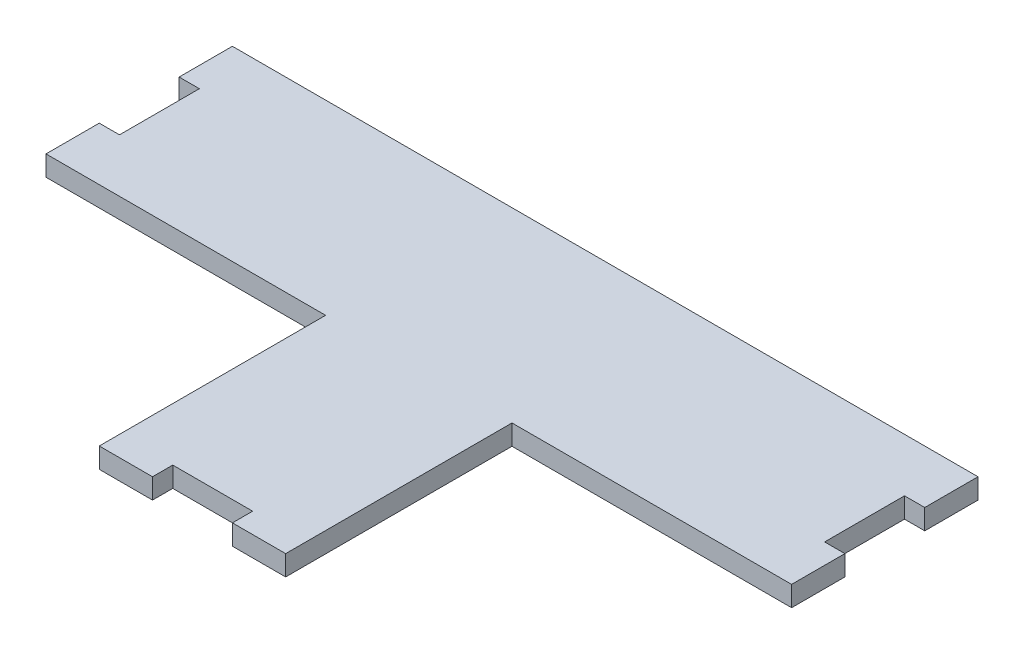
ISO-10303-21;
HEADER;
FILE_DESCRIPTION(('STEP AP214'),'2;1');
FILE_NAME('part.step','',(''),(''),'','','');
FILE_SCHEMA(('AUTOMOTIVE_DESIGN { 1 0 10303 214 1 1 1 1 }'));
ENDSEC;
DATA;
#1=APPLICATION_CONTEXT('core data for automotive mechanical design processes');
#2=APPLICATION_PROTOCOL_DEFINITION('international standard','automotive_design',2000,#1);
#3=PRODUCT_CONTEXT('',#1,'mechanical');
#4=PRODUCT('Part','Part','',(#3));
#5=PRODUCT_RELATED_PRODUCT_CATEGORY('part','',(#4));
#6=PRODUCT_DEFINITION_FORMATION('','',#4);
#7=PRODUCT_DEFINITION_CONTEXT('part definition',#1,'design');
#8=PRODUCT_DEFINITION('design','',#6,#7);
#9=PRODUCT_DEFINITION_SHAPE('','',#8);
#10=(LENGTH_UNIT() NAMED_UNIT(*) SI_UNIT(.MILLI.,.METRE.));
#11=(NAMED_UNIT(*) PLANE_ANGLE_UNIT() SI_UNIT($,.RADIAN.));
#12=(NAMED_UNIT(*) SI_UNIT($,.STERADIAN.) SOLID_ANGLE_UNIT());
#13=UNCERTAINTY_MEASURE_WITH_UNIT(LENGTH_MEASURE(1.E-05),#10,'distance_accuracy_value','');
#14=(GEOMETRIC_REPRESENTATION_CONTEXT(3) GLOBAL_UNCERTAINTY_ASSIGNED_CONTEXT((#13)) GLOBAL_UNIT_ASSIGNED_CONTEXT((#10,
#11,#12)) REPRESENTATION_CONTEXT('',''));
#15=CARTESIAN_POINT('',(0.,0.,0.));
#16=DIRECTION('',(0.,0.,1.));
#17=DIRECTION('',(1.,0.,0.));
#18=AXIS2_PLACEMENT_3D('',#15,#16,#17);
#19=CARTESIAN_POINT('',(0.,4.826,0.));
#20=DIRECTION('',(0.,0.,-1.));
#21=DIRECTION('',(-1.,0.,0.));
#22=AXIS2_PLACEMENT_3D('',#19,#20,#21);
#23=PLANE('',#22);
#24=DIRECTION('',(1.,0.,0.));
#25=VECTOR('',#24,1.);
#26=CARTESIAN_POINT('',(0.,4.826,0.));
#27=LINE('',#26,#25);
#28=CARTESIAN_POINT('',(66.675,4.826,0.));
#29=VERTEX_POINT('',#28);
#30=CARTESIAN_POINT('',(79.375,4.826,0.));
#31=VERTEX_POINT('',#30);
#32=EDGE_CURVE('E239',#29,#31,#27,.T.);
#33=ORIENTED_EDGE('',*,*,#32,.F.);
#34=DIRECTION('',(0.,1.,0.));
#35=VECTOR('',#34,1.);
#36=CARTESIAN_POINT('',(66.675,0.,0.));
#37=LINE('',#36,#35);
#38=CARTESIAN_POINT('',(66.675,0.,0.));
#39=VERTEX_POINT('',#38);
#40=EDGE_CURVE('E271',#39,#29,#37,.T.);
#41=ORIENTED_EDGE('',*,*,#40,.F.);
#42=DIRECTION('',(1.,0.,0.));
#43=VECTOR('',#42,1.);
#44=CARTESIAN_POINT('',(0.,0.,0.));
#45=LINE('',#44,#43);
#46=CARTESIAN_POINT('',(79.375,0.,0.));
#47=VERTEX_POINT('',#46);
#48=EDGE_CURVE('E197',#39,#47,#45,.T.);
#49=ORIENTED_EDGE('',*,*,#48,.T.);
#50=DIRECTION('',(0.,1.,0.));
#51=VECTOR('',#50,1.);
#52=CARTESIAN_POINT('',(79.375,0.,0.));
#53=LINE('',#52,#51);
#54=EDGE_CURVE('E290',#47,#31,#53,.T.);
#55=ORIENTED_EDGE('',*,*,#54,.T.);
#56=EDGE_LOOP('',(#33,#41,#49,#55));
#57=FACE_BOUND('',#56,.T.);
#58=ADVANCED_FACE('F32',(#57),#23,.F.);
#59=CARTESIAN_POINT('',(177.8,4.826,0.));
#60=DIRECTION('',(-1.,0.,0.));
#61=DIRECTION('',(0.,0.,1.));
#62=AXIS2_PLACEMENT_3D('',#59,#60,#61);
#63=PLANE('',#62);
#64=DIRECTION('',(0.,0.,-1.));
#65=VECTOR('',#64,1.);
#66=CARTESIAN_POINT('',(177.8,4.826,0.));
#67=LINE('',#66,#65);
#68=CARTESIAN_POINT('',(177.8,4.826,-53.975));
#69=VERTEX_POINT('',#68);
#70=CARTESIAN_POINT('',(177.8,4.826,-66.675));
#71=VERTEX_POINT('',#70);
#72=EDGE_CURVE('E185',#69,#71,#67,.T.);
#73=ORIENTED_EDGE('',*,*,#72,.F.);
#74=DIRECTION('',(0.,1.,0.));
#75=VECTOR('',#74,1.);
#76=CARTESIAN_POINT('',(177.8,0.,-53.975));
#77=LINE('',#76,#75);
#78=CARTESIAN_POINT('',(177.8,0.,-53.975));
#79=VERTEX_POINT('',#78);
#80=EDGE_CURVE('E172',#79,#69,#77,.T.);
#81=ORIENTED_EDGE('',*,*,#80,.F.);
#82=DIRECTION('',(0.,0.,-1.));
#83=VECTOR('',#82,1.);
#84=CARTESIAN_POINT('',(177.8,0.,0.));
#85=LINE('',#84,#83);
#86=CARTESIAN_POINT('',(177.8,0.,-66.675));
#87=VERTEX_POINT('',#86);
#88=EDGE_CURVE('E183',#79,#87,#85,.T.);
#89=ORIENTED_EDGE('',*,*,#88,.T.);
#90=DIRECTION('',(0.,1.,0.));
#91=VECTOR('',#90,1.);
#92=CARTESIAN_POINT('',(177.8,0.,-66.675));
#93=LINE('',#92,#91);
#94=EDGE_CURVE('E318',#87,#71,#93,.T.);
#95=ORIENTED_EDGE('',*,*,#94,.T.);
#96=EDGE_LOOP('',(#73,#81,#89,#95));
#97=FACE_BOUND('',#96,.T.);
#98=ADVANCED_FACE('F181',(#97),#63,.F.);
#99=CARTESIAN_POINT('',(0.,4.826,0.));
#100=DIRECTION('',(1.,0.,0.));
#101=DIRECTION('',(0.,0.,-1.));
#102=AXIS2_PLACEMENT_3D('',#99,#100,#101);
#103=PLANE('',#102);
#104=DIRECTION('',(0.,0.,1.));
#105=VECTOR('',#104,1.);
#106=CARTESIAN_POINT('',(0.,0.,0.));
#107=LINE('',#106,#105);
#108=CARTESIAN_POINT('',(0.,0.,-98.425));
#109=VERTEX_POINT('',#108);
#110=CARTESIAN_POINT('',(0.,0.,-85.725));
#111=VERTEX_POINT('',#110);
#112=EDGE_CURVE('E214',#109,#111,#107,.T.);
#113=ORIENTED_EDGE('',*,*,#112,.T.);
#114=DIRECTION('',(0.,1.,0.));
#115=VECTOR('',#114,1.);
#116=CARTESIAN_POINT('',(0.,0.,-85.725));
#117=LINE('',#116,#115);
#118=CARTESIAN_POINT('',(0.,4.826,-85.725));
#119=VERTEX_POINT('',#118);
#120=EDGE_CURVE('E220',#111,#119,#117,.T.);
#121=ORIENTED_EDGE('',*,*,#120,.T.);
#122=DIRECTION('',(0.,0.,1.));
#123=VECTOR('',#122,1.);
#124=CARTESIAN_POINT('',(0.,4.826,0.));
#125=LINE('',#124,#123);
#126=CARTESIAN_POINT('',(0.,4.826,-98.425));
#127=VERTEX_POINT('',#126);
#128=EDGE_CURVE('E237',#127,#119,#125,.T.);
#129=ORIENTED_EDGE('',*,*,#128,.F.);
#130=DIRECTION('',(0.,-1.,0.));
#131=VECTOR('',#130,1.);
#132=CARTESIAN_POINT('',(0.,4.826,-98.425));
#133=LINE('',#132,#131);
#134=EDGE_CURVE('E40',#127,#109,#133,.T.);
#135=ORIENTED_EDGE('',*,*,#134,.T.);
#136=EDGE_LOOP('',(#113,#121,#129,#135));
#137=FACE_BOUND('',#136,.T.);
#138=ADVANCED_FACE('F344',(#137),#103,.F.);
#139=CARTESIAN_POINT('',(0.,0.,-66.675));
#140=VERTEX_POINT('',#139);
#141=CARTESIAN_POINT('',(0.,0.,-53.975));
#142=VERTEX_POINT('',#141);
#143=EDGE_CURVE('E216',#140,#142,#107,.T.);
#144=ORIENTED_EDGE('',*,*,#143,.T.);
#145=DIRECTION('',(0.,1.,0.));
#146=VECTOR('',#145,1.);
#147=CARTESIAN_POINT('',(0.,0.,-53.975));
#148=LINE('',#147,#146);
#149=CARTESIAN_POINT('',(0.,4.826,-53.975));
#150=VERTEX_POINT('',#149);
#151=EDGE_CURVE('E274',#142,#150,#148,.T.);
#152=ORIENTED_EDGE('',*,*,#151,.T.);
#153=CARTESIAN_POINT('',(0.,4.826,-66.675));
#154=VERTEX_POINT('',#153);
#155=EDGE_CURVE('E195',#154,#150,#125,.T.);
#156=ORIENTED_EDGE('',*,*,#155,.F.);
#157=DIRECTION('',(0.,1.,0.));
#158=VECTOR('',#157,1.);
#159=CARTESIAN_POINT('',(0.,0.,-66.675));
#160=LINE('',#159,#158);
#161=EDGE_CURVE('E234',#140,#154,#160,.T.);
#162=ORIENTED_EDGE('',*,*,#161,.F.);
#163=EDGE_LOOP('',(#144,#152,#156,#162));
#164=FACE_BOUND('',#163,.T.);
#165=ADVANCED_FACE('F34',(#164),#103,.F.);
#166=CARTESIAN_POINT('',(98.425,0.,0.));
#167=VERTEX_POINT('',#166);
#168=CARTESIAN_POINT('',(111.125,0.,0.));
#169=VERTEX_POINT('',#168);
#170=EDGE_CURVE('E215',#167,#169,#45,.T.);
#171=ORIENTED_EDGE('',*,*,#170,.T.);
#172=DIRECTION('',(0.,1.,0.));
#173=VECTOR('',#172,1.);
#174=CARTESIAN_POINT('',(111.125,0.,0.));
#175=LINE('',#174,#173);
#176=CARTESIAN_POINT('',(111.125,4.826,0.));
#177=VERTEX_POINT('',#176);
#178=EDGE_CURVE('E258',#169,#177,#175,.T.);
#179=ORIENTED_EDGE('',*,*,#178,.T.);
#180=CARTESIAN_POINT('',(98.425,4.826,0.));
#181=VERTEX_POINT('',#180);
#182=EDGE_CURVE('E238',#181,#177,#27,.T.);
#183=ORIENTED_EDGE('',*,*,#182,.F.);
#184=DIRECTION('',(0.,1.,0.));
#185=VECTOR('',#184,1.);
#186=CARTESIAN_POINT('',(98.425,0.,0.));
#187=LINE('',#186,#185);
#188=EDGE_CURVE('E256',#167,#181,#187,.T.);
#189=ORIENTED_EDGE('',*,*,#188,.F.);
#190=EDGE_LOOP('',(#171,#179,#183,#189));
#191=FACE_BOUND('',#190,.T.);
#192=ADVANCED_FACE('F255',(#191),#23,.F.);
#193=CARTESIAN_POINT('',(177.8,4.826,-85.725));
#194=VERTEX_POINT('',#193);
#195=CARTESIAN_POINT('',(177.8,4.826,-98.425));
#196=VERTEX_POINT('',#195);
#197=EDGE_CURVE('E211',#194,#196,#67,.T.);
#198=ORIENTED_EDGE('',*,*,#197,.F.);
#199=DIRECTION('',(0.,1.,0.));
#200=VECTOR('',#199,1.);
#201=CARTESIAN_POINT('',(177.8,0.,-85.725));
#202=LINE('',#201,#200);
#203=CARTESIAN_POINT('',(177.8,0.,-85.725));
#204=VERTEX_POINT('',#203);
#205=EDGE_CURVE('E310',#204,#194,#202,.T.);
#206=ORIENTED_EDGE('',*,*,#205,.F.);
#207=CARTESIAN_POINT('',(177.8,0.,-98.425));
#208=VERTEX_POINT('',#207);
#209=EDGE_CURVE('E193',#204,#208,#85,.T.);
#210=ORIENTED_EDGE('',*,*,#209,.T.);
#211=DIRECTION('',(0.,-1.,0.));
#212=VECTOR('',#211,1.);
#213=CARTESIAN_POINT('',(177.8,4.826,-98.425));
#214=LINE('',#213,#212);
#215=EDGE_CURVE('E11',#196,#208,#214,.T.);
#216=ORIENTED_EDGE('',*,*,#215,.F.);
#217=EDGE_LOOP('',(#198,#206,#210,#216));
#218=FACE_BOUND('',#217,.T.);
#219=ADVANCED_FACE('F351',(#218),#63,.F.);
#220=CARTESIAN_POINT('',(0.,4.826,-98.425));
#221=DIRECTION('',(0.,0.,1.));
#222=DIRECTION('',(1.,0.,0.));
#223=AXIS2_PLACEMENT_3D('',#220,#221,#222);
#224=PLANE('',#223);
#225=DIRECTION('',(-1.,0.,0.));
#226=VECTOR('',#225,1.);
#227=CARTESIAN_POINT('',(0.,0.,-98.425));
#228=LINE('',#227,#226);
#229=EDGE_CURVE('E192',#208,#109,#228,.T.);
#230=ORIENTED_EDGE('',*,*,#229,.T.);
#231=ORIENTED_EDGE('',*,*,#134,.F.);
#232=DIRECTION('',(-1.,0.,0.));
#233=VECTOR('',#232,1.);
#234=CARTESIAN_POINT('',(0.,4.826,-98.425));
#235=LINE('',#234,#233);
#236=EDGE_CURVE('E201',#196,#127,#235,.T.);
#237=ORIENTED_EDGE('',*,*,#236,.F.);
#238=ORIENTED_EDGE('',*,*,#215,.T.);
#239=EDGE_LOOP('',(#230,#231,#237,#238));
#240=FACE_BOUND('',#239,.T.);
#241=ADVANCED_FACE('F360',(#240),#224,.F.);
#242=CARTESIAN_POINT('',(0.,4.826,0.));
#243=DIRECTION('',(0.,-1.,0.));
#244=DIRECTION('',(0.,0.,-1.));
#245=AXIS2_PLACEMENT_3D('',#242,#243,#244);
#246=PLANE('',#245);
#247=ORIENTED_EDGE('',*,*,#182,.T.);
#248=DIRECTION('',(0.,0.,1.));
#249=VECTOR('',#248,1.);
#250=CARTESIAN_POINT('',(111.125,4.826,0.));
#251=LINE('',#250,#249);
#252=CARTESIAN_POINT('',(111.125,4.826,-53.975));
#253=VERTEX_POINT('',#252);
#254=EDGE_CURVE('E177',#253,#177,#251,.T.);
#255=ORIENTED_EDGE('',*,*,#254,.F.);
#256=DIRECTION('',(-1.,0.,0.));
#257=VECTOR('',#256,1.);
#258=CARTESIAN_POINT('',(177.8,4.826,-53.975));
#259=LINE('',#258,#257);
#260=EDGE_CURVE('E419',#69,#253,#259,.T.);
#261=ORIENTED_EDGE('',*,*,#260,.F.);
#262=ORIENTED_EDGE('',*,*,#72,.T.);
#263=DIRECTION('',(1.,0.,0.));
#264=VECTOR('',#263,1.);
#265=CARTESIAN_POINT('',(177.8,4.826,-66.675));
#266=LINE('',#265,#264);
#267=CARTESIAN_POINT('',(172.974,4.826,-66.675));
#268=VERTEX_POINT('',#267);
#269=EDGE_CURVE('E307',#268,#71,#266,.T.);
#270=ORIENTED_EDGE('',*,*,#269,.F.);
#271=DIRECTION('',(0.,0.,1.));
#272=VECTOR('',#271,1.);
#273=CARTESIAN_POINT('',(172.974,4.826,-85.725));
#274=LINE('',#273,#272);
#275=CARTESIAN_POINT('',(172.974,4.826,-85.725));
#276=VERTEX_POINT('',#275);
#277=EDGE_CURVE('E313',#276,#268,#274,.T.);
#278=ORIENTED_EDGE('',*,*,#277,.F.);
#279=DIRECTION('',(-1.,0.,0.));
#280=VECTOR('',#279,1.);
#281=CARTESIAN_POINT('',(177.8,4.826,-85.725));
#282=LINE('',#281,#280);
#283=EDGE_CURVE('E297',#194,#276,#282,.T.);
#284=ORIENTED_EDGE('',*,*,#283,.F.);
#285=ORIENTED_EDGE('',*,*,#197,.T.);
#286=ORIENTED_EDGE('',*,*,#236,.T.);
#287=ORIENTED_EDGE('',*,*,#128,.T.);
#288=DIRECTION('',(-1.,0.,0.));
#289=VECTOR('',#288,1.);
#290=CARTESIAN_POINT('',(0.,4.826,-85.725));
#291=LINE('',#290,#289);
#292=CARTESIAN_POINT('',(4.82599999999997,4.826,-85.725));
#293=VERTEX_POINT('',#292);
#294=EDGE_CURVE('E230',#293,#119,#291,.T.);
#295=ORIENTED_EDGE('',*,*,#294,.F.);
#296=DIRECTION('',(0.,0.,-1.));
#297=VECTOR('',#296,1.);
#298=CARTESIAN_POINT('',(4.82599999999997,4.826,-85.725));
#299=LINE('',#298,#297);
#300=CARTESIAN_POINT('',(4.82599999999997,4.826,-66.675));
#301=VERTEX_POINT('',#300);
#302=EDGE_CURVE('E335',#301,#293,#299,.T.);
#303=ORIENTED_EDGE('',*,*,#302,.F.);
#304=DIRECTION('',(1.,0.,0.));
#305=VECTOR('',#304,1.);
#306=CARTESIAN_POINT('',(0.,4.826,-66.675));
#307=LINE('',#306,#305);
#308=EDGE_CURVE('E320',#154,#301,#307,.T.);
#309=ORIENTED_EDGE('',*,*,#308,.F.);
#310=ORIENTED_EDGE('',*,*,#155,.T.);
#311=DIRECTION('',(-1.,0.,0.));
#312=VECTOR('',#311,1.);
#313=CARTESIAN_POINT('',(0.,4.826,-53.975));
#314=LINE('',#313,#312);
#315=CARTESIAN_POINT('',(66.675,4.826,-53.975));
#316=VERTEX_POINT('',#315);
#317=EDGE_CURVE('E262',#316,#150,#314,.T.);
#318=ORIENTED_EDGE('',*,*,#317,.F.);
#319=DIRECTION('',(0.,0.,-1.));
#320=VECTOR('',#319,1.);
#321=CARTESIAN_POINT('',(66.675,4.826,0.));
#322=LINE('',#321,#320);
#323=EDGE_CURVE('E259',#29,#316,#322,.T.);
#324=ORIENTED_EDGE('',*,*,#323,.F.);
#325=ORIENTED_EDGE('',*,*,#32,.T.);
#326=DIRECTION('',(0.,0.,1.));
#327=VECTOR('',#326,1.);
#328=CARTESIAN_POINT('',(79.375,4.826,0.));
#329=LINE('',#328,#327);
#330=CARTESIAN_POINT('',(79.3749999999999,4.826,-4.826));
#331=VERTEX_POINT('',#330);
#332=EDGE_CURVE('E276',#331,#31,#329,.T.);
#333=ORIENTED_EDGE('',*,*,#332,.F.);
#334=DIRECTION('',(-1.,0.,0.));
#335=VECTOR('',#334,1.);
#336=CARTESIAN_POINT('',(79.3749999999999,4.826,-4.826));
#337=LINE('',#336,#335);
#338=CARTESIAN_POINT('',(98.425,4.826,-4.826));
#339=VERTEX_POINT('',#338);
#340=EDGE_CURVE('E284',#339,#331,#337,.T.);
#341=ORIENTED_EDGE('',*,*,#340,.F.);
#342=DIRECTION('',(0.,0.,-1.));
#343=VECTOR('',#342,1.);
#344=CARTESIAN_POINT('',(98.425,4.826,0.));
#345=LINE('',#344,#343);
#346=EDGE_CURVE('E251',#181,#339,#345,.T.);
#347=ORIENTED_EDGE('',*,*,#346,.F.);
#348=EDGE_LOOP('',(#247,#255,#261,#262,#270,#278,#284,#285,#286,#287,#295,#303,#309,#310,#318,
#324,#325,#333,#341,#347));
#349=FACE_BOUND('',#348,.T.);
#350=ADVANCED_FACE('F248',(#349),#246,.F.);
#351=CARTESIAN_POINT('',(0.,0.,0.));
#352=DIRECTION('',(0.,-1.,0.));
#353=DIRECTION('',(0.,0.,-1.));
#354=AXIS2_PLACEMENT_3D('',#351,#352,#353);
#355=PLANE('',#354);
#356=DIRECTION('',(0.,0.,1.));
#357=VECTOR('',#356,1.);
#358=CARTESIAN_POINT('',(111.125,0.,0.));
#359=LINE('',#358,#357);
#360=CARTESIAN_POINT('',(111.125,0.,-53.975));
#361=VERTEX_POINT('',#360);
#362=EDGE_CURVE('E47',#361,#169,#359,.T.);
#363=ORIENTED_EDGE('',*,*,#362,.T.);
#364=ORIENTED_EDGE('',*,*,#170,.F.);
#365=DIRECTION('',(0.,0.,-1.));
#366=VECTOR('',#365,1.);
#367=CARTESIAN_POINT('',(98.425,0.,0.));
#368=LINE('',#367,#366);
#369=CARTESIAN_POINT('',(98.425,0.,-4.826));
#370=VERTEX_POINT('',#369);
#371=EDGE_CURVE('E283',#167,#370,#368,.T.);
#372=ORIENTED_EDGE('',*,*,#371,.T.);
#373=DIRECTION('',(-1.,0.,0.));
#374=VECTOR('',#373,1.);
#375=CARTESIAN_POINT('',(79.3749999999999,0.,-4.826));
#376=LINE('',#375,#374);
#377=CARTESIAN_POINT('',(79.3749999999999,0.,-4.826));
#378=VERTEX_POINT('',#377);
#379=EDGE_CURVE('E287',#370,#378,#376,.T.);
#380=ORIENTED_EDGE('',*,*,#379,.T.);
#381=DIRECTION('',(0.,0.,1.));
#382=VECTOR('',#381,1.);
#383=CARTESIAN_POINT('',(79.375,0.,0.));
#384=LINE('',#383,#382);
#385=EDGE_CURVE('E280',#378,#47,#384,.T.);
#386=ORIENTED_EDGE('',*,*,#385,.T.);
#387=ORIENTED_EDGE('',*,*,#48,.F.);
#388=DIRECTION('',(0.,0.,-1.));
#389=VECTOR('',#388,1.);
#390=CARTESIAN_POINT('',(66.675,0.,0.));
#391=LINE('',#390,#389);
#392=CARTESIAN_POINT('',(66.675,0.,-53.975));
#393=VERTEX_POINT('',#392);
#394=EDGE_CURVE('E268',#39,#393,#391,.T.);
#395=ORIENTED_EDGE('',*,*,#394,.T.);
#396=DIRECTION('',(-1.,0.,0.));
#397=VECTOR('',#396,1.);
#398=CARTESIAN_POINT('',(0.,0.,-53.975));
#399=LINE('',#398,#397);
#400=EDGE_CURVE('E55',#393,#142,#399,.T.);
#401=ORIENTED_EDGE('',*,*,#400,.T.);
#402=ORIENTED_EDGE('',*,*,#143,.F.);
#403=DIRECTION('',(1.,0.,0.));
#404=VECTOR('',#403,1.);
#405=CARTESIAN_POINT('',(0.,0.,-66.675));
#406=LINE('',#405,#404);
#407=CARTESIAN_POINT('',(4.82599999999997,0.,-66.675));
#408=VERTEX_POINT('',#407);
#409=EDGE_CURVE('E326',#140,#408,#406,.T.);
#410=ORIENTED_EDGE('',*,*,#409,.T.);
#411=DIRECTION('',(0.,0.,-1.));
#412=VECTOR('',#411,1.);
#413=CARTESIAN_POINT('',(4.82599999999997,0.,-85.725));
#414=LINE('',#413,#412);
#415=CARTESIAN_POINT('',(4.82599999999997,0.,-85.725));
#416=VERTEX_POINT('',#415);
#417=EDGE_CURVE('E329',#408,#416,#414,.T.);
#418=ORIENTED_EDGE('',*,*,#417,.T.);
#419=DIRECTION('',(-1.,0.,0.));
#420=VECTOR('',#419,1.);
#421=CARTESIAN_POINT('',(0.,0.,-85.725));
#422=LINE('',#421,#420);
#423=EDGE_CURVE('E236',#416,#111,#422,.T.);
#424=ORIENTED_EDGE('',*,*,#423,.T.);
#425=ORIENTED_EDGE('',*,*,#112,.F.);
#426=ORIENTED_EDGE('',*,*,#229,.F.);
#427=ORIENTED_EDGE('',*,*,#209,.F.);
#428=DIRECTION('',(-1.,0.,0.));
#429=VECTOR('',#428,1.);
#430=CARTESIAN_POINT('',(177.8,0.,-85.725));
#431=LINE('',#430,#429);
#432=CARTESIAN_POINT('',(172.974,0.,-85.725));
#433=VERTEX_POINT('',#432);
#434=EDGE_CURVE('E303',#204,#433,#431,.T.);
#435=ORIENTED_EDGE('',*,*,#434,.T.);
#436=DIRECTION('',(0.,0.,1.));
#437=VECTOR('',#436,1.);
#438=CARTESIAN_POINT('',(172.974,0.,-85.725));
#439=LINE('',#438,#437);
#440=CARTESIAN_POINT('',(172.974,0.,-66.675));
#441=VERTEX_POINT('',#440);
#442=EDGE_CURVE('E306',#433,#441,#439,.T.);
#443=ORIENTED_EDGE('',*,*,#442,.T.);
#444=DIRECTION('',(1.,0.,0.));
#445=VECTOR('',#444,1.);
#446=CARTESIAN_POINT('',(177.8,0.,-66.675));
#447=LINE('',#446,#445);
#448=EDGE_CURVE('E191',#441,#87,#447,.T.);
#449=ORIENTED_EDGE('',*,*,#448,.T.);
#450=ORIENTED_EDGE('',*,*,#88,.F.);
#451=DIRECTION('',(-1.,0.,0.));
#452=VECTOR('',#451,1.);
#453=CARTESIAN_POINT('',(177.8,0.,-53.975));
#454=LINE('',#453,#452);
#455=EDGE_CURVE('E168',#79,#361,#454,.T.);
#456=ORIENTED_EDGE('',*,*,#455,.T.);
#457=EDGE_LOOP('',(#363,#364,#372,#380,#386,#387,#395,#401,#402,#410,#418,#424,#425,#426,#427,
#435,#443,#449,#450,#456));
#458=FACE_BOUND('',#457,.T.);
#459=ADVANCED_FACE('F188',(#458),#355,.T.);
#460=CARTESIAN_POINT('',(0.,0.,-85.725));
#461=DIRECTION('',(0.,0.,-1.));
#462=DIRECTION('',(-1.,0.,0.));
#463=AXIS2_PLACEMENT_3D('',#460,#461,#462);
#464=PLANE('',#463);
#465=ORIENTED_EDGE('',*,*,#294,.T.);
#466=ORIENTED_EDGE('',*,*,#120,.F.);
#467=ORIENTED_EDGE('',*,*,#423,.F.);
#468=DIRECTION('',(0.,1.,0.));
#469=VECTOR('',#468,1.);
#470=CARTESIAN_POINT('',(4.82599999999997,0.,-85.725));
#471=LINE('',#470,#469);
#472=EDGE_CURVE('E225',#416,#293,#471,.T.);
#473=ORIENTED_EDGE('',*,*,#472,.T.);
#474=EDGE_LOOP('',(#465,#466,#467,#473));
#475=FACE_BOUND('',#474,.T.);
#476=ADVANCED_FACE('F341',(#475),#464,.F.);
#477=CARTESIAN_POINT('',(4.82599999999997,0.,-85.725));
#478=DIRECTION('',(1.,0.,0.));
#479=DIRECTION('',(0.,0.,-1.));
#480=AXIS2_PLACEMENT_3D('',#477,#478,#479);
#481=PLANE('',#480);
#482=ORIENTED_EDGE('',*,*,#302,.T.);
#483=ORIENTED_EDGE('',*,*,#472,.F.);
#484=ORIENTED_EDGE('',*,*,#417,.F.);
#485=DIRECTION('',(0.,1.,0.));
#486=VECTOR('',#485,1.);
#487=CARTESIAN_POINT('',(4.82599999999997,0.,-66.675));
#488=LINE('',#487,#486);
#489=EDGE_CURVE('E227',#408,#301,#488,.T.);
#490=ORIENTED_EDGE('',*,*,#489,.T.);
#491=EDGE_LOOP('',(#482,#483,#484,#490));
#492=FACE_BOUND('',#491,.T.);
#493=ADVANCED_FACE('F377',(#492),#481,.F.);
#494=CARTESIAN_POINT('',(0.,0.,-66.675));
#495=DIRECTION('',(0.,0.,1.));
#496=DIRECTION('',(1.,0.,0.));
#497=AXIS2_PLACEMENT_3D('',#494,#495,#496);
#498=PLANE('',#497);
#499=ORIENTED_EDGE('',*,*,#308,.T.);
#500=ORIENTED_EDGE('',*,*,#489,.F.);
#501=ORIENTED_EDGE('',*,*,#409,.F.);
#502=ORIENTED_EDGE('',*,*,#161,.T.);
#503=EDGE_LOOP('',(#499,#500,#501,#502));
#504=FACE_BOUND('',#503,.T.);
#505=ADVANCED_FACE('F373',(#504),#498,.F.);
#506=CARTESIAN_POINT('',(177.8,0.,-66.675));
#507=DIRECTION('',(0.,0.,1.));
#508=DIRECTION('',(1.,0.,0.));
#509=AXIS2_PLACEMENT_3D('',#506,#507,#508);
#510=PLANE('',#509);
#511=ORIENTED_EDGE('',*,*,#269,.T.);
#512=ORIENTED_EDGE('',*,*,#94,.F.);
#513=ORIENTED_EDGE('',*,*,#448,.F.);
#514=DIRECTION('',(0.,1.,0.));
#515=VECTOR('',#514,1.);
#516=CARTESIAN_POINT('',(172.974,0.,-66.675));
#517=LINE('',#516,#515);
#518=EDGE_CURVE('E321',#441,#268,#517,.T.);
#519=ORIENTED_EDGE('',*,*,#518,.T.);
#520=EDGE_LOOP('',(#511,#512,#513,#519));
#521=FACE_BOUND('',#520,.T.);
#522=ADVANCED_FACE('F376',(#521),#510,.F.);
#523=CARTESIAN_POINT('',(172.974,0.,-85.725));
#524=DIRECTION('',(-1.,0.,0.));
#525=DIRECTION('',(0.,0.,1.));
#526=AXIS2_PLACEMENT_3D('',#523,#524,#525);
#527=PLANE('',#526);
#528=ORIENTED_EDGE('',*,*,#277,.T.);
#529=ORIENTED_EDGE('',*,*,#518,.F.);
#530=ORIENTED_EDGE('',*,*,#442,.F.);
#531=DIRECTION('',(0.,1.,0.));
#532=VECTOR('',#531,1.);
#533=CARTESIAN_POINT('',(172.974,0.,-85.725));
#534=LINE('',#533,#532);
#535=EDGE_CURVE('E323',#433,#276,#534,.T.);
#536=ORIENTED_EDGE('',*,*,#535,.T.);
#537=EDGE_LOOP('',(#528,#529,#530,#536));
#538=FACE_BOUND('',#537,.T.);
#539=ADVANCED_FACE('F387',(#538),#527,.F.);
#540=CARTESIAN_POINT('',(177.8,0.,-85.725));
#541=DIRECTION('',(0.,0.,-1.));
#542=DIRECTION('',(-1.,0.,0.));
#543=AXIS2_PLACEMENT_3D('',#540,#541,#542);
#544=PLANE('',#543);
#545=ORIENTED_EDGE('',*,*,#283,.T.);
#546=ORIENTED_EDGE('',*,*,#535,.F.);
#547=ORIENTED_EDGE('',*,*,#434,.F.);
#548=ORIENTED_EDGE('',*,*,#205,.T.);
#549=EDGE_LOOP('',(#545,#546,#547,#548));
#550=FACE_BOUND('',#549,.T.);
#551=ADVANCED_FACE('F383',(#550),#544,.F.);
#552=CARTESIAN_POINT('',(79.375,0.,0.));
#553=DIRECTION('',(-1.,0.,0.));
#554=DIRECTION('',(0.,0.,1.));
#555=AXIS2_PLACEMENT_3D('',#552,#553,#554);
#556=PLANE('',#555);
#557=ORIENTED_EDGE('',*,*,#332,.T.);
#558=ORIENTED_EDGE('',*,*,#54,.F.);
#559=ORIENTED_EDGE('',*,*,#385,.F.);
#560=DIRECTION('',(0.,1.,0.));
#561=VECTOR('',#560,1.);
#562=CARTESIAN_POINT('',(79.3749999999999,0.,-4.826));
#563=LINE('',#562,#561);
#564=EDGE_CURVE('E295',#378,#331,#563,.T.);
#565=ORIENTED_EDGE('',*,*,#564,.T.);
#566=EDGE_LOOP('',(#557,#558,#559,#565));
#567=FACE_BOUND('',#566,.T.);
#568=ADVANCED_FACE('F386',(#567),#556,.F.);
#569=CARTESIAN_POINT('',(79.3749999999999,0.,-4.826));
#570=DIRECTION('',(0.,0.,-1.));
#571=DIRECTION('',(-1.,0.,0.));
#572=AXIS2_PLACEMENT_3D('',#569,#570,#571);
#573=PLANE('',#572);
#574=ORIENTED_EDGE('',*,*,#340,.T.);
#575=ORIENTED_EDGE('',*,*,#564,.F.);
#576=ORIENTED_EDGE('',*,*,#379,.F.);
#577=DIRECTION('',(0.,1.,0.));
#578=VECTOR('',#577,1.);
#579=CARTESIAN_POINT('',(98.425,0.,-4.826));
#580=LINE('',#579,#578);
#581=EDGE_CURVE('E298',#370,#339,#580,.T.);
#582=ORIENTED_EDGE('',*,*,#581,.T.);
#583=EDGE_LOOP('',(#574,#575,#576,#582));
#584=FACE_BOUND('',#583,.T.);
#585=ADVANCED_FACE('F397',(#584),#573,.F.);
#586=CARTESIAN_POINT('',(98.425,0.,0.));
#587=DIRECTION('',(1.,0.,0.));
#588=DIRECTION('',(0.,0.,-1.));
#589=AXIS2_PLACEMENT_3D('',#586,#587,#588);
#590=PLANE('',#589);
#591=ORIENTED_EDGE('',*,*,#346,.T.);
#592=ORIENTED_EDGE('',*,*,#581,.F.);
#593=ORIENTED_EDGE('',*,*,#371,.F.);
#594=ORIENTED_EDGE('',*,*,#188,.T.);
#595=EDGE_LOOP('',(#591,#592,#593,#594));
#596=FACE_BOUND('',#595,.T.);
#597=ADVANCED_FACE('F399',(#596),#590,.F.);
#598=CARTESIAN_POINT('',(0.,0.,-53.975));
#599=DIRECTION('',(0.,0.,-1.));
#600=DIRECTION('',(-1.,0.,0.));
#601=AXIS2_PLACEMENT_3D('',#598,#599,#600);
#602=PLANE('',#601);
#603=ORIENTED_EDGE('',*,*,#317,.T.);
#604=ORIENTED_EDGE('',*,*,#151,.F.);
#605=ORIENTED_EDGE('',*,*,#400,.F.);
#606=DIRECTION('',(0.,1.,0.));
#607=VECTOR('',#606,1.);
#608=CARTESIAN_POINT('',(66.675,0.,-53.975));
#609=LINE('',#608,#607);
#610=EDGE_CURVE('E277',#393,#316,#609,.T.);
#611=ORIENTED_EDGE('',*,*,#610,.T.);
#612=EDGE_LOOP('',(#603,#604,#605,#611));
#613=FACE_BOUND('',#612,.T.);
#614=ADVANCED_FACE('F402',(#613),#602,.F.);
#615=CARTESIAN_POINT('',(66.675,0.,0.));
#616=DIRECTION('',(1.,0.,0.));
#617=DIRECTION('',(0.,0.,-1.));
#618=AXIS2_PLACEMENT_3D('',#615,#616,#617);
#619=PLANE('',#618);
#620=ORIENTED_EDGE('',*,*,#323,.T.);
#621=ORIENTED_EDGE('',*,*,#610,.F.);
#622=ORIENTED_EDGE('',*,*,#394,.F.);
#623=ORIENTED_EDGE('',*,*,#40,.T.);
#624=EDGE_LOOP('',(#620,#621,#622,#623));
#625=FACE_BOUND('',#624,.T.);
#626=ADVANCED_FACE('F407',(#625),#619,.F.);
#627=CARTESIAN_POINT('',(111.125,0.,0.));
#628=DIRECTION('',(-1.,0.,0.));
#629=DIRECTION('',(0.,0.,1.));
#630=AXIS2_PLACEMENT_3D('',#627,#628,#629);
#631=PLANE('',#630);
#632=ORIENTED_EDGE('',*,*,#254,.T.);
#633=ORIENTED_EDGE('',*,*,#178,.F.);
#634=ORIENTED_EDGE('',*,*,#362,.F.);
#635=DIRECTION('',(0.,1.,0.));
#636=VECTOR('',#635,1.);
#637=CARTESIAN_POINT('',(111.125,0.,-53.975));
#638=LINE('',#637,#636);
#639=EDGE_CURVE('E174',#361,#253,#638,.T.);
#640=ORIENTED_EDGE('',*,*,#639,.T.);
#641=EDGE_LOOP('',(#632,#633,#634,#640));
#642=FACE_BOUND('',#641,.T.);
#643=ADVANCED_FACE('F410',(#642),#631,.F.);
#644=CARTESIAN_POINT('',(177.8,0.,-53.975));
#645=DIRECTION('',(0.,0.,-1.));
#646=DIRECTION('',(-1.,0.,0.));
#647=AXIS2_PLACEMENT_3D('',#644,#645,#646);
#648=PLANE('',#647);
#649=ORIENTED_EDGE('',*,*,#260,.T.);
#650=ORIENTED_EDGE('',*,*,#639,.F.);
#651=ORIENTED_EDGE('',*,*,#455,.F.);
#652=ORIENTED_EDGE('',*,*,#80,.T.);
#653=EDGE_LOOP('',(#649,#650,#651,#652));
#654=FACE_BOUND('',#653,.T.);
#655=ADVANCED_FACE('F171',(#654),#648,.F.);
#656=CLOSED_SHELL('',(#58,#98,#138,#165,#192,#219,#241,#350,#459,#476,#493,#505,#522,#539,#551,
#568,#585,#597,#614,#626,#643,#655));
#657=MANIFOLD_SOLID_BREP('B2',#656);
#658=ADVANCED_BREP_SHAPE_REPRESENTATION('',(#18,#657),#14);
#659=SHAPE_DEFINITION_REPRESENTATION(#9,#658);
ENDSEC;
END-ISO-10303-21;
